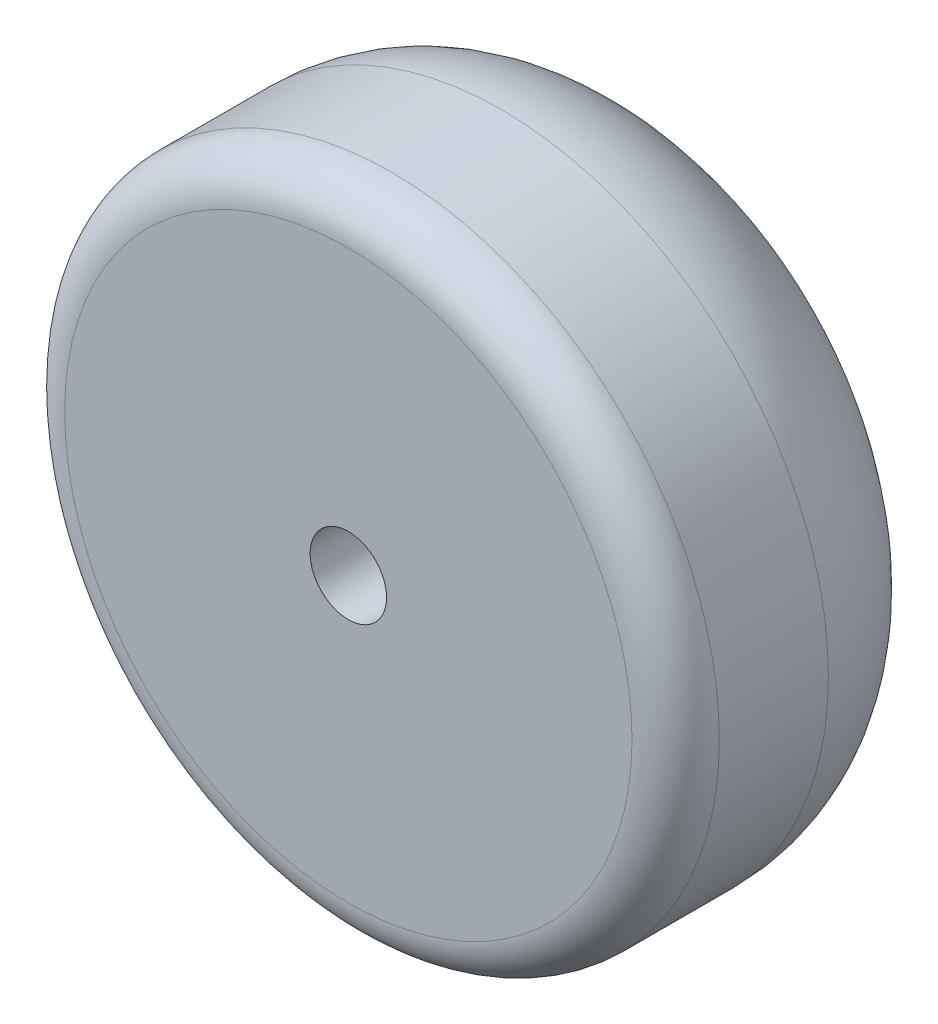
ISO-10303-21;
HEADER;
FILE_DESCRIPTION(('STEP AP214'),'2;1');
FILE_NAME('part.step','',(''),(''),'','','');
FILE_SCHEMA(('AUTOMOTIVE_DESIGN { 1 0 10303 214 1 1 1 1 }'));
ENDSEC;
DATA;
#1=APPLICATION_CONTEXT('core data for automotive mechanical design processes');
#2=APPLICATION_PROTOCOL_DEFINITION('international standard','automotive_design',2000,#1);
#3=PRODUCT_CONTEXT('',#1,'mechanical');
#4=PRODUCT('Part','Part','',(#3));
#5=PRODUCT_RELATED_PRODUCT_CATEGORY('part','',(#4));
#6=PRODUCT_DEFINITION_FORMATION('','',#4);
#7=PRODUCT_DEFINITION_CONTEXT('part definition',#1,'design');
#8=PRODUCT_DEFINITION('design','',#6,#7);
#9=PRODUCT_DEFINITION_SHAPE('','',#8);
#10=(LENGTH_UNIT() NAMED_UNIT(*) SI_UNIT(.MILLI.,.METRE.));
#11=(NAMED_UNIT(*) PLANE_ANGLE_UNIT() SI_UNIT($,.RADIAN.));
#12=(NAMED_UNIT(*) SI_UNIT($,.STERADIAN.) SOLID_ANGLE_UNIT());
#13=UNCERTAINTY_MEASURE_WITH_UNIT(LENGTH_MEASURE(1.E-05),#10,'distance_accuracy_value','');
#14=(GEOMETRIC_REPRESENTATION_CONTEXT(3) GLOBAL_UNCERTAINTY_ASSIGNED_CONTEXT((#13)) GLOBAL_UNIT_ASSIGNED_CONTEXT((#10,
#11,#12)) REPRESENTATION_CONTEXT('',''));
#15=CARTESIAN_POINT('',(0.,0.,0.));
#16=DIRECTION('',(0.,0.,1.));
#17=DIRECTION('',(1.,0.,0.));
#18=AXIS2_PLACEMENT_3D('',#15,#16,#17);
#19=CARTESIAN_POINT('',(0.,0.,14.));
#20=DIRECTION('',(0.,0.,1.));
#21=DIRECTION('',(1.,0.,0.));
#22=AXIS2_PLACEMENT_3D('',#19,#20,#21);
#23=PLANE('',#22);
#24=CARTESIAN_POINT('',(0.,0.,14.));
#25=DIRECTION('',(0.,0.,1.));
#26=DIRECTION('',(1.,0.,0.));
#27=AXIS2_PLACEMENT_3D('',#24,#25,#26);
#28=CIRCLE('',#27,13.);
#29=CARTESIAN_POINT('',(13.,0.,14.));
#30=VERTEX_POINT('',#29);
#31=EDGE_CURVE('E45',#30,#30,#28,.T.);
#32=ORIENTED_EDGE('',*,*,#31,.T.);
#33=EDGE_LOOP('',(#32));
#34=FACE_BOUND('',#33,.T.);
#35=CARTESIAN_POINT('',(0.,0.,14.));
#36=DIRECTION('',(0.,0.,1.));
#37=DIRECTION('',(1.,0.,0.));
#38=AXIS2_PLACEMENT_3D('',#35,#36,#37);
#39=CIRCLE('',#38,1.75);
#40=CARTESIAN_POINT('',(1.75,0.,14.));
#41=VERTEX_POINT('',#40);
#42=EDGE_CURVE('E50',#41,#41,#39,.T.);
#43=ORIENTED_EDGE('',*,*,#42,.F.);
#44=EDGE_LOOP('',(#43));
#45=FACE_BOUND('',#44,.T.);
#46=ADVANCED_FACE('F30',(#34,#45),#23,.T.);
#47=CARTESIAN_POINT('',(0.,0.,0.));
#48=DIRECTION('',(0.,0.,1.));
#49=DIRECTION('',(1.,0.,0.));
#50=AXIS2_PLACEMENT_3D('',#47,#48,#49);
#51=PLANE('',#50);
#52=CARTESIAN_POINT('',(0.,0.,0.));
#53=DIRECTION('',(0.,0.,1.));
#54=DIRECTION('',(1.,0.,0.));
#55=AXIS2_PLACEMENT_3D('',#52,#53,#54);
#56=CIRCLE('',#55,8.);
#57=CARTESIAN_POINT('',(8.,0.,0.));
#58=VERTEX_POINT('',#57);
#59=EDGE_CURVE('E10',#58,#58,#56,.F.);
#60=ORIENTED_EDGE('',*,*,#59,.T.);
#61=EDGE_LOOP('',(#60));
#62=FACE_BOUND('',#61,.T.);
#63=CARTESIAN_POINT('',(0.,0.,0.));
#64=DIRECTION('',(0.,0.,1.));
#65=DIRECTION('',(1.,0.,0.));
#66=AXIS2_PLACEMENT_3D('',#63,#64,#65);
#67=CIRCLE('',#66,1.75);
#68=CARTESIAN_POINT('',(1.75,0.,0.));
#69=VERTEX_POINT('',#68);
#70=EDGE_CURVE('E51',#69,#69,#67,.T.);
#71=ORIENTED_EDGE('',*,*,#70,.T.);
#72=EDGE_LOOP('',(#71));
#73=FACE_BOUND('',#72,.T.);
#74=ADVANCED_FACE('F61',(#62,#73),#51,.F.);
#75=CARTESIAN_POINT('',(0.,0.,14.));
#76=DIRECTION('',(0.,0.,-1.));
#77=DIRECTION('',(-1.,0.,0.));
#78=AXIS2_PLACEMENT_3D('',#75,#76,#77);
#79=CYLINDRICAL_SURFACE('',#78,15.);
#80=CARTESIAN_POINT('',(0.,0.,7.));
#81=DIRECTION('',(0.,0.,1.));
#82=DIRECTION('',(1.,0.,0.));
#83=AXIS2_PLACEMENT_3D('',#80,#81,#82);
#84=CIRCLE('',#83,15.);
#85=CARTESIAN_POINT('',(15.,0.,7.));
#86=VERTEX_POINT('',#85);
#87=EDGE_CURVE('E37',#86,#86,#84,.T.);
#88=ORIENTED_EDGE('',*,*,#87,.T.);
#89=EDGE_LOOP('',(#88));
#90=FACE_BOUND('',#89,.T.);
#91=CARTESIAN_POINT('',(0.,0.,12.));
#92=DIRECTION('',(0.,0.,1.));
#93=DIRECTION('',(1.,0.,0.));
#94=AXIS2_PLACEMENT_3D('',#91,#92,#93);
#95=CIRCLE('',#94,15.);
#96=CARTESIAN_POINT('',(15.,0.,12.));
#97=VERTEX_POINT('',#96);
#98=EDGE_CURVE('E41',#97,#97,#95,.F.);
#99=ORIENTED_EDGE('',*,*,#98,.T.);
#100=EDGE_LOOP('',(#99));
#101=FACE_BOUND('',#100,.T.);
#102=ADVANCED_FACE('F67',(#90,#101),#79,.T.);
#103=CARTESIAN_POINT('',(0.,0.,14.));
#104=DIRECTION('',(0.,0.,-1.));
#105=DIRECTION('',(-1.,0.,0.));
#106=AXIS2_PLACEMENT_3D('',#103,#104,#105);
#107=CYLINDRICAL_SURFACE('',#106,1.75);
#108=ORIENTED_EDGE('',*,*,#42,.T.);
#109=EDGE_LOOP('',(#108));
#110=FACE_BOUND('',#109,.T.);
#111=ORIENTED_EDGE('',*,*,#70,.F.);
#112=EDGE_LOOP('',(#111));
#113=FACE_BOUND('',#112,.T.);
#114=ADVANCED_FACE('F57',(#110,#113),#107,.F.);
#115=CARTESIAN_POINT('',(0.,0.,12.));
#116=DIRECTION('',(0.,0.,1.));
#117=DIRECTION('',(1.,0.,0.));
#118=AXIS2_PLACEMENT_3D('',#115,#116,#117);
#119=TOROIDAL_SURFACE('',#118,13.,2.);
#120=ORIENTED_EDGE('',*,*,#98,.F.);
#121=EDGE_LOOP('',(#120));
#122=FACE_BOUND('',#121,.T.);
#123=ORIENTED_EDGE('',*,*,#31,.F.);
#124=EDGE_LOOP('',(#123));
#125=FACE_BOUND('',#124,.T.);
#126=ADVANCED_FACE('F72',(#122,#125),#119,.T.);
#127=CARTESIAN_POINT('',(0.,0.,7.));
#128=DIRECTION('',(0.,0.,1.));
#129=DIRECTION('',(1.,0.,0.));
#130=AXIS2_PLACEMENT_3D('',#127,#128,#129);
#131=TOROIDAL_SURFACE('',#130,8.,7.);
#132=ORIENTED_EDGE('',*,*,#59,.F.);
#133=EDGE_LOOP('',(#132));
#134=FACE_BOUND('',#133,.T.);
#135=ORIENTED_EDGE('',*,*,#87,.F.);
#136=EDGE_LOOP('',(#135));
#137=FACE_BOUND('',#136,.T.);
#138=ADVANCED_FACE('F32',(#134,#137),#131,.T.);
#139=CLOSED_SHELL('',(#46,#74,#102,#114,#126,#138));
#140=MANIFOLD_SOLID_BREP('B2',#139);
#141=ADVANCED_BREP_SHAPE_REPRESENTATION('',(#18,#140),#14);
#142=SHAPE_DEFINITION_REPRESENTATION(#9,#141);
ENDSEC;
END-ISO-10303-21;
